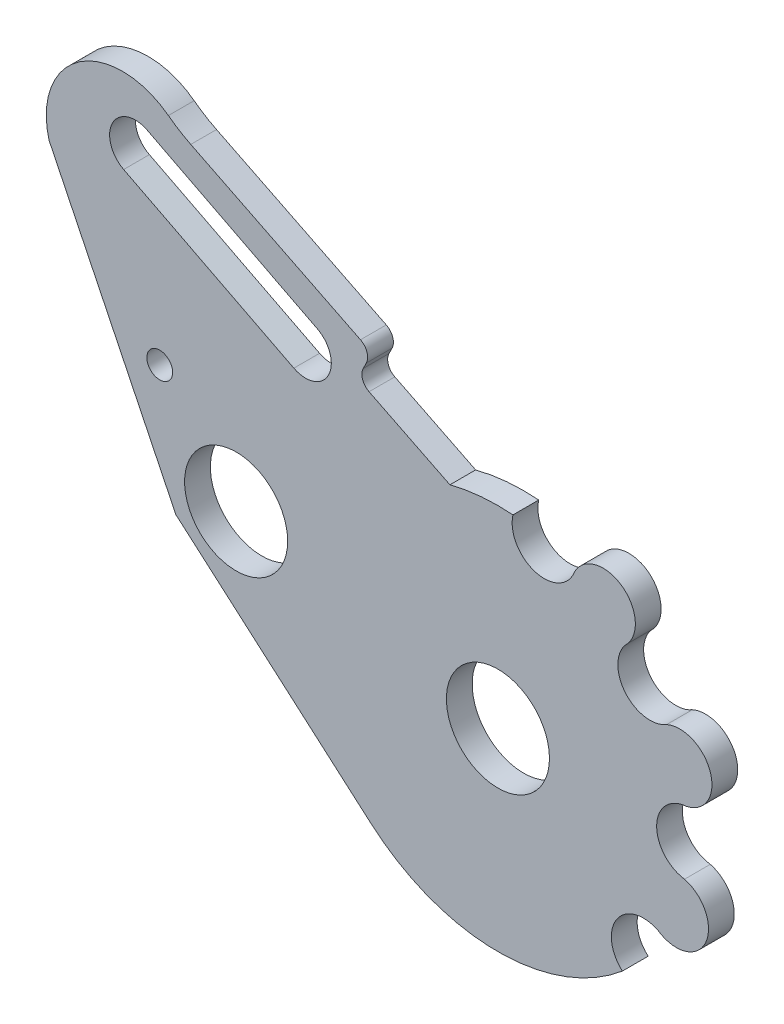
ISO-10303-21;
HEADER;
FILE_DESCRIPTION(('STEP AP214'),'2;1');
FILE_NAME('part.step','',(''),(''),'','','');
FILE_SCHEMA(('AUTOMOTIVE_DESIGN { 1 0 10303 214 1 1 1 1 }'));
ENDSEC;
DATA;
#1=APPLICATION_CONTEXT('core data for automotive mechanical design processes');
#2=APPLICATION_PROTOCOL_DEFINITION('international standard','automotive_design',2000,#1);
#3=PRODUCT_CONTEXT('',#1,'mechanical');
#4=PRODUCT('Part','Part','',(#3));
#5=PRODUCT_RELATED_PRODUCT_CATEGORY('part','',(#4));
#6=PRODUCT_DEFINITION_FORMATION('','',#4);
#7=PRODUCT_DEFINITION_CONTEXT('part definition',#1,'design');
#8=PRODUCT_DEFINITION('design','',#6,#7);
#9=PRODUCT_DEFINITION_SHAPE('','',#8);
#10=(LENGTH_UNIT() NAMED_UNIT(*) SI_UNIT(.MILLI.,.METRE.));
#11=(NAMED_UNIT(*) PLANE_ANGLE_UNIT() SI_UNIT($,.RADIAN.));
#12=(NAMED_UNIT(*) SI_UNIT($,.STERADIAN.) SOLID_ANGLE_UNIT());
#13=UNCERTAINTY_MEASURE_WITH_UNIT(LENGTH_MEASURE(1.E-05),#10,'distance_accuracy_value','');
#14=(GEOMETRIC_REPRESENTATION_CONTEXT(3) GLOBAL_UNCERTAINTY_ASSIGNED_CONTEXT((#13)) GLOBAL_UNIT_ASSIGNED_CONTEXT((#10,
#11,#12)) REPRESENTATION_CONTEXT('',''));
#15=CARTESIAN_POINT('',(0.,0.,0.));
#16=DIRECTION('',(0.,0.,1.));
#17=DIRECTION('',(1.,0.,0.));
#18=AXIS2_PLACEMENT_3D('',#15,#16,#17);
#19=CARTESIAN_POINT('',(-14.9359678839183,18.0926132591885,2.));
#20=DIRECTION('',(0.,0.,-1.));
#21=DIRECTION('',(-1.,0.,0.));
#22=AXIS2_PLACEMENT_3D('',#19,#20,#21);
#23=CYLINDRICAL_SURFACE('',#22,2.);
#24=CARTESIAN_POINT('',(-14.9359678839183,18.0926132591885,0.));
#25=DIRECTION('',(0.,0.,1.));
#26=DIRECTION('',(1.,0.,0.));
#27=AXIS2_PLACEMENT_3D('',#24,#25,#26);
#28=CIRCLE('',#27,2.);
#29=CARTESIAN_POINT('',(-15.846044198805,16.3116693799261,0.));
#30=VERTEX_POINT('',#29);
#31=CARTESIAN_POINT('',(-14.0258915690315,19.8735571384509,0.));
#32=VERTEX_POINT('',#31);
#33=EDGE_CURVE('E308',#30,#32,#28,.T.);
#34=ORIENTED_EDGE('',*,*,#33,.F.);
#35=DIRECTION('',(0.,0.,-1.));
#36=VECTOR('',#35,1.);
#37=CARTESIAN_POINT('',(-15.846044198805,16.3116693799261,2.));
#38=LINE('',#37,#36);
#39=CARTESIAN_POINT('',(-15.846044198805,16.3116693799261,2.));
#40=VERTEX_POINT('',#39);
#41=EDGE_CURVE('E324',#40,#30,#38,.T.);
#42=ORIENTED_EDGE('',*,*,#41,.F.);
#43=CARTESIAN_POINT('',(-14.9359678839183,18.0926132591885,2.));
#44=DIRECTION('',(0.,0.,1.));
#45=DIRECTION('',(1.,0.,0.));
#46=AXIS2_PLACEMENT_3D('',#43,#44,#45);
#47=CIRCLE('',#46,2.);
#48=CARTESIAN_POINT('',(-14.0258915690315,19.8735571384509,2.));
#49=VERTEX_POINT('',#48);
#50=EDGE_CURVE('E250',#40,#49,#47,.T.);
#51=ORIENTED_EDGE('',*,*,#50,.T.);
#52=DIRECTION('',(0.,0.,-1.));
#53=VECTOR('',#52,1.);
#54=CARTESIAN_POINT('',(-14.0258915690315,19.8735571384509,2.));
#55=LINE('',#54,#53);
#56=EDGE_CURVE('E194',#49,#32,#55,.T.);
#57=ORIENTED_EDGE('',*,*,#56,.T.);
#58=EDGE_LOOP('',(#34,#42,#51,#57));
#59=FACE_BOUND('',#58,.T.);
#60=ADVANCED_FACE('F35',(#59),#23,.F.);
#61=CARTESIAN_POINT('',(3.32838985168127,6.51338292974766,2.));
#62=DIRECTION('',(0.455038157443362,0.890471939631199,0.));
#63=DIRECTION('',(-0.890471939631199,0.455038157443362,0.));
#64=AXIS2_PLACEMENT_3D('',#61,#62,#63);
#65=PLANE('',#64);
#66=DIRECTION('',(0.890471939631199,-0.455038157443362,0.));
#67=VECTOR('',#66,1.);
#68=CARTESIAN_POINT('',(3.32838985168127,6.51338292974766,0.));
#69=LINE('',#68,#67);
#70=CARTESIAN_POINT('',(-29.0580755639299,23.0631212122661,0.));
#71=VERTEX_POINT('',#70);
#72=EDGE_CURVE('E311',#71,#30,#69,.T.);
#73=ORIENTED_EDGE('',*,*,#72,.F.);
#74=DIRECTION('',(0.,0.,-1.));
#75=VECTOR('',#74,1.);
#76=CARTESIAN_POINT('',(-29.0580755639299,23.0631212122661,2.));
#77=LINE('',#76,#75);
#78=CARTESIAN_POINT('',(-29.0580755639299,23.0631212122661,2.));
#79=VERTEX_POINT('',#78);
#80=EDGE_CURVE('E322',#79,#71,#77,.T.);
#81=ORIENTED_EDGE('',*,*,#80,.F.);
#82=DIRECTION('',(0.890471939631199,-0.455038157443362,0.));
#83=VECTOR('',#82,1.);
#84=CARTESIAN_POINT('',(3.32838985168127,6.51338292974766,2.));
#85=LINE('',#84,#83);
#86=EDGE_CURVE('E253',#79,#40,#85,.T.);
#87=ORIENTED_EDGE('',*,*,#86,.T.);
#88=ORIENTED_EDGE('',*,*,#41,.T.);
#89=EDGE_LOOP('',(#73,#81,#87,#88));
#90=FACE_BOUND('',#89,.T.);
#91=ADVANCED_FACE('F394',(#90),#65,.T.);
#92=CARTESIAN_POINT('',(-28.1479992490432,24.8440650915285,2.));
#93=DIRECTION('',(0.,0.,-1.));
#94=DIRECTION('',(-1.,0.,0.));
#95=AXIS2_PLACEMENT_3D('',#92,#93,#94);
#96=CYLINDRICAL_SURFACE('',#95,2.);
#97=CARTESIAN_POINT('',(-28.1479992490432,24.8440650915285,0.));
#98=DIRECTION('',(0.,0.,1.));
#99=DIRECTION('',(1.,0.,0.));
#100=AXIS2_PLACEMENT_3D('',#97,#98,#99);
#101=CIRCLE('',#100,2.);
#102=CARTESIAN_POINT('',(-27.2379229341565,26.6250089707909,0.));
#103=VERTEX_POINT('',#102);
#104=EDGE_CURVE('E314',#103,#71,#101,.T.);
#105=ORIENTED_EDGE('',*,*,#104,.F.);
#106=DIRECTION('',(0.,0.,-1.));
#107=VECTOR('',#106,1.);
#108=CARTESIAN_POINT('',(-27.2379229341565,26.6250089707909,2.));
#109=LINE('',#108,#107);
#110=CARTESIAN_POINT('',(-27.2379229341565,26.6250089707909,2.));
#111=VERTEX_POINT('',#110);
#112=EDGE_CURVE('E320',#111,#103,#109,.T.);
#113=ORIENTED_EDGE('',*,*,#112,.F.);
#114=CARTESIAN_POINT('',(-28.1479992490432,24.8440650915285,2.));
#115=DIRECTION('',(0.,0.,1.));
#116=DIRECTION('',(1.,0.,0.));
#117=AXIS2_PLACEMENT_3D('',#114,#115,#116);
#118=CIRCLE('',#117,2.);
#119=EDGE_CURVE('E256',#111,#79,#118,.T.);
#120=ORIENTED_EDGE('',*,*,#119,.T.);
#121=ORIENTED_EDGE('',*,*,#80,.T.);
#122=EDGE_LOOP('',(#105,#113,#120,#121));
#123=FACE_BOUND('',#122,.T.);
#124=ADVANCED_FACE('F400',(#123),#96,.F.);
#125=CARTESIAN_POINT('',(11.3067980667604,-9.59252122782368,2.));
#126=DIRECTION('',(0.,0.,-1.));
#127=DIRECTION('',(-1.,0.,0.));
#128=AXIS2_PLACEMENT_3D('',#125,#126,#127);
#129=CYLINDRICAL_SURFACE('',#128,2.5);
#130=CARTESIAN_POINT('',(11.3067980667604,-9.59252122782368,0.));
#131=DIRECTION('',(0.,0.,1.));
#132=DIRECTION('',(1.,0.,0.));
#133=AXIS2_PLACEMENT_3D('',#130,#131,#132);
#134=CIRCLE('',#133,2.5);
#135=CARTESIAN_POINT('',(12.711512496022,-7.52448414589692,0.));
#136=VERTEX_POINT('',#135);
#137=CARTESIAN_POINT('',(9.66110025477495,-11.4744560597524,0.));
#138=VERTEX_POINT('',#137);
#139=EDGE_CURVE('E190',#136,#138,#134,.T.);
#140=ORIENTED_EDGE('',*,*,#139,.F.);
#141=DIRECTION('',(0.,0.,-1.));
#142=VECTOR('',#141,1.);
#143=CARTESIAN_POINT('',(12.711512496022,-7.52448414589692,2.));
#144=LINE('',#143,#142);
#145=CARTESIAN_POINT('',(12.711512496022,-7.52448414589692,2.));
#146=VERTEX_POINT('',#145);
#147=EDGE_CURVE('E184',#146,#136,#144,.T.);
#148=ORIENTED_EDGE('',*,*,#147,.F.);
#149=CARTESIAN_POINT('',(11.3067980667604,-9.59252122782368,2.));
#150=DIRECTION('',(0.,0.,1.));
#151=DIRECTION('',(1.,0.,0.));
#152=AXIS2_PLACEMENT_3D('',#149,#150,#151);
#153=CIRCLE('',#152,2.5);
#154=CARTESIAN_POINT('',(9.66110025477495,-11.4744560597524,2.));
#155=VERTEX_POINT('',#154);
#156=EDGE_CURVE('E188',#146,#155,#153,.T.);
#157=ORIENTED_EDGE('',*,*,#156,.T.);
#158=DIRECTION('',(0.,0.,-1.));
#159=VECTOR('',#158,1.);
#160=CARTESIAN_POINT('',(9.66110025477495,-11.4744560597524,2.));
#161=LINE('',#160,#159);
#162=EDGE_CURVE('E261',#155,#138,#161,.T.);
#163=ORIENTED_EDGE('',*,*,#162,.T.);
#164=EDGE_LOOP('',(#140,#148,#157,#163));
#165=FACE_BOUND('',#164,.T.);
#166=ADVANCED_FACE('F186',(#165),#129,.F.);
#167=CARTESIAN_POINT('',(13.8488157974996,-5.29815505960978,2.));
#168=DIRECTION('',(0.,0.,-1.));
#169=DIRECTION('',(-1.,0.,0.));
#170=AXIS2_PLACEMENT_3D('',#167,#168,#169);
#171=CYLINDRICAL_SURFACE('',#170,2.5);
#172=CARTESIAN_POINT('',(13.8488157974996,-5.29815505960978,0.));
#173=DIRECTION('',(0.,0.,1.));
#174=DIRECTION('',(1.,0.,0.));
#175=AXIS2_PLACEMENT_3D('',#172,#173,#174);
#176=CIRCLE('',#175,2.5);
#177=CARTESIAN_POINT('',(14.4878912158803,-2.88121844281123,0.));
#178=VERTEX_POINT('',#177);
#179=EDGE_CURVE('E266',#136,#178,#176,.T.);
#180=ORIENTED_EDGE('',*,*,#179,.T.);
#181=DIRECTION('',(0.,0.,-1.));
#182=VECTOR('',#181,1.);
#183=CARTESIAN_POINT('',(14.4878912158803,-2.88121844281123,2.));
#184=LINE('',#183,#182);
#185=CARTESIAN_POINT('',(14.4878912158803,-2.88121844281123,2.));
#186=VERTEX_POINT('',#185);
#187=EDGE_CURVE('E195',#186,#178,#184,.T.);
#188=ORIENTED_EDGE('',*,*,#187,.F.);
#189=CARTESIAN_POINT('',(13.8488157974996,-5.29815505960978,2.));
#190=DIRECTION('',(0.,0.,1.));
#191=DIRECTION('',(1.,0.,0.));
#192=AXIS2_PLACEMENT_3D('',#189,#190,#191);
#193=CIRCLE('',#192,2.5);
#194=EDGE_CURVE('E198',#146,#186,#193,.T.);
#195=ORIENTED_EDGE('',*,*,#194,.F.);
#196=ORIENTED_EDGE('',*,*,#147,.T.);
#197=EDGE_LOOP('',(#180,#188,#195,#196));
#198=FACE_BOUND('',#197,.T.);
#199=ADVANCED_FACE('F199',(#198),#171,.T.);
#200=CARTESIAN_POINT('',(14.8221859615863,-0.403669851361737,2.));
#201=DIRECTION('',(0.,0.,-1.));
#202=DIRECTION('',(-1.,0.,0.));
#203=AXIS2_PLACEMENT_3D('',#200,#201,#202);
#204=CYLINDRICAL_SURFACE('',#203,2.5);
#205=CARTESIAN_POINT('',(14.8221859615863,-0.403669851361737,0.));
#206=DIRECTION('',(0.,0.,1.));
#207=DIRECTION('',(1.,0.,0.));
#208=AXIS2_PLACEMENT_3D('',#205,#206,#207);
#209=CIRCLE('',#208,2.5);
#210=CARTESIAN_POINT('',(14.6232346563307,2.08840125078144,0.));
#211=VERTEX_POINT('',#210);
#212=EDGE_CURVE('E268',#211,#178,#209,.T.);
#213=ORIENTED_EDGE('',*,*,#212,.F.);
#214=DIRECTION('',(0.,0.,-1.));
#215=VECTOR('',#214,1.);
#216=CARTESIAN_POINT('',(14.6232346563307,2.08840125078144,2.));
#217=LINE('',#216,#215);
#218=CARTESIAN_POINT('',(14.6232346563307,2.08840125078144,2.));
#219=VERTEX_POINT('',#218);
#220=EDGE_CURVE('E348',#219,#211,#217,.T.);
#221=ORIENTED_EDGE('',*,*,#220,.F.);
#222=CARTESIAN_POINT('',(14.8221859615863,-0.403669851361737,2.));
#223=DIRECTION('',(0.,0.,1.));
#224=DIRECTION('',(1.,0.,0.));
#225=AXIS2_PLACEMENT_3D('',#222,#223,#224);
#226=CIRCLE('',#225,2.5);
#227=EDGE_CURVE('E203',#219,#186,#226,.T.);
#228=ORIENTED_EDGE('',*,*,#227,.T.);
#229=ORIENTED_EDGE('',*,*,#187,.T.);
#230=EDGE_LOOP('',(#213,#221,#228,#229));
#231=FACE_BOUND('',#230,.T.);
#232=ADVANCED_FACE('F454',(#231),#204,.F.);
#233=CARTESIAN_POINT('',(14.1166554686715,4.53653881363009,2.));
#234=DIRECTION('',(0.,0.,-1.));
#235=DIRECTION('',(-1.,0.,0.));
#236=AXIS2_PLACEMENT_3D('',#233,#234,#235);
#237=CYLINDRICAL_SURFACE('',#236,2.50000000000001);
#238=CARTESIAN_POINT('',(14.1166554686715,4.53653881363009,0.));
#239=DIRECTION('',(0.,0.,1.));
#240=DIRECTION('',(1.,0.,0.));
#241=AXIS2_PLACEMENT_3D('',#238,#239,#240);
#242=CIRCLE('',#241,2.50000000000001);
#243=CARTESIAN_POINT('',(13.1022125420899,6.82146891074653,0.));
#244=VERTEX_POINT('',#243);
#245=EDGE_CURVE('E271',#211,#244,#242,.T.);
#246=ORIENTED_EDGE('',*,*,#245,.T.);
#247=DIRECTION('',(0.,0.,-1.));
#248=VECTOR('',#247,1.);
#249=CARTESIAN_POINT('',(13.1022125420899,6.82146891074653,2.));
#250=LINE('',#249,#248);
#251=CARTESIAN_POINT('',(13.1022125420899,6.82146891074653,2.));
#252=VERTEX_POINT('',#251);
#253=EDGE_CURVE('E346',#252,#244,#250,.T.);
#254=ORIENTED_EDGE('',*,*,#253,.F.);
#255=CARTESIAN_POINT('',(14.1166554686715,4.53653881363009,2.));
#256=DIRECTION('',(0.,0.,1.));
#257=DIRECTION('',(1.,0.,0.));
#258=AXIS2_PLACEMENT_3D('',#255,#256,#257);
#259=CIRCLE('',#258,2.50000000000001);
#260=EDGE_CURVE('E218',#219,#252,#259,.T.);
#261=ORIENTED_EDGE('',*,*,#260,.F.);
#262=ORIENTED_EDGE('',*,*,#220,.T.);
#263=EDGE_LOOP('',(#246,#254,#261,#262));
#264=FACE_BOUND('',#263,.T.);
#265=ADVANCED_FACE('F450',(#264),#237,.T.);
#266=CARTESIAN_POINT('',(11.8121393603798,8.96289628187838,2.));
#267=DIRECTION('',(0.,0.,-1.));
#268=DIRECTION('',(-1.,0.,0.));
#269=AXIS2_PLACEMENT_3D('',#266,#267,#268);
#270=CYLINDRICAL_SURFACE('',#269,2.5);
#271=CARTESIAN_POINT('',(11.8121393603798,8.96289628187838,0.));
#272=DIRECTION('',(0.,0.,1.));
#273=DIRECTION('',(1.,0.,0.));
#274=AXIS2_PLACEMENT_3D('',#271,#272,#273);
#275=CIRCLE('',#274,2.5);
#276=CARTESIAN_POINT('',(10.0971101914994,10.7818726285881,0.));
#277=VERTEX_POINT('',#276);
#278=EDGE_CURVE('E274',#277,#244,#275,.T.);
#279=ORIENTED_EDGE('',*,*,#278,.F.);
#280=DIRECTION('',(0.,0.,-1.));
#281=VECTOR('',#280,1.);
#282=CARTESIAN_POINT('',(10.0971101914994,10.7818726285881,2.));
#283=LINE('',#282,#281);
#284=CARTESIAN_POINT('',(10.0971101914994,10.7818726285881,2.));
#285=VERTEX_POINT('',#284);
#286=EDGE_CURVE('E344',#285,#277,#283,.T.);
#287=ORIENTED_EDGE('',*,*,#286,.F.);
#288=CARTESIAN_POINT('',(11.8121393603798,8.96289628187838,2.));
#289=DIRECTION('',(0.,0.,1.));
#290=DIRECTION('',(1.,0.,0.));
#291=AXIS2_PLACEMENT_3D('',#288,#289,#290);
#292=CIRCLE('',#291,2.5);
#293=EDGE_CURVE('E220',#285,#252,#292,.T.);
#294=ORIENTED_EDGE('',*,*,#293,.T.);
#295=ORIENTED_EDGE('',*,*,#253,.T.);
#296=EDGE_LOOP('',(#279,#287,#294,#295));
#297=FACE_BOUND('',#296,.T.);
#298=ADVANCED_FACE('F446',(#297),#270,.F.);
#299=CARTESIAN_POINT('',(8.16966887854774,12.3740315355842,2.));
#300=DIRECTION('',(0.,0.,-1.));
#301=DIRECTION('',(-1.,0.,0.));
#302=AXIS2_PLACEMENT_3D('',#299,#300,#301);
#303=CYLINDRICAL_SURFACE('',#302,2.5);
#304=CARTESIAN_POINT('',(8.16966887854774,12.3740315355842,0.));
#305=DIRECTION('',(0.,0.,1.));
#306=DIRECTION('',(1.,0.,0.));
#307=AXIS2_PLACEMENT_3D('',#304,#305,#306);
#308=CIRCLE('',#307,2.5);
#309=CARTESIAN_POINT('',(5.94831385553742,13.5210197054215,0.));
#310=VERTEX_POINT('',#309);
#311=EDGE_CURVE('E277',#277,#310,#308,.T.);
#312=ORIENTED_EDGE('',*,*,#311,.T.);
#313=DIRECTION('',(0.,0.,-1.));
#314=VECTOR('',#313,1.);
#315=CARTESIAN_POINT('',(5.94831385553742,13.5210197054215,2.));
#316=LINE('',#315,#314);
#317=CARTESIAN_POINT('',(5.94831385553742,13.5210197054215,2.));
#318=VERTEX_POINT('',#317);
#319=EDGE_CURVE('E342',#318,#310,#316,.T.);
#320=ORIENTED_EDGE('',*,*,#319,.F.);
#321=CARTESIAN_POINT('',(8.16966887854774,12.3740315355842,2.));
#322=DIRECTION('',(0.,0.,1.));
#323=DIRECTION('',(1.,0.,0.));
#324=AXIS2_PLACEMENT_3D('',#321,#322,#323);
#325=CIRCLE('',#324,2.5);
#326=EDGE_CURVE('E223',#285,#318,#325,.T.);
#327=ORIENTED_EDGE('',*,*,#326,.F.);
#328=ORIENTED_EDGE('',*,*,#286,.T.);
#329=EDGE_LOOP('',(#312,#320,#327,#328));
#330=FACE_BOUND('',#329,.T.);
#331=ADVANCED_FACE('F442',(#330),#303,.T.);
#332=CARTESIAN_POINT('',(3.60182460345563,14.3835672054844,2.));
#333=DIRECTION('',(0.,0.,-1.));
#334=DIRECTION('',(-1.,0.,0.));
#335=AXIS2_PLACEMENT_3D('',#332,#333,#334);
#336=CYLINDRICAL_SURFACE('',#335,2.5);
#337=CARTESIAN_POINT('',(3.60182460345563,14.3835672054844,0.));
#338=DIRECTION('',(0.,0.,1.));
#339=DIRECTION('',(1.,0.,0.));
#340=AXIS2_PLACEMENT_3D('',#337,#338,#339);
#341=CIRCLE('',#340,2.5);
#342=CARTESIAN_POINT('',(1.16788239643984,14.95446591183,0.));
#343=VERTEX_POINT('',#342);
#344=EDGE_CURVE('E280',#343,#310,#341,.T.);
#345=ORIENTED_EDGE('',*,*,#344,.F.);
#346=DIRECTION('',(0.,0.,-1.));
#347=VECTOR('',#346,1.);
#348=CARTESIAN_POINT('',(1.16788239643984,14.95446591183,2.));
#349=LINE('',#348,#347);
#350=CARTESIAN_POINT('',(1.16788239643984,14.95446591183,2.));
#351=VERTEX_POINT('',#350);
#352=EDGE_CURVE('E340',#351,#343,#349,.T.);
#353=ORIENTED_EDGE('',*,*,#352,.F.);
#354=CARTESIAN_POINT('',(3.60182460345563,14.3835672054844,2.));
#355=DIRECTION('',(0.,0.,1.));
#356=DIRECTION('',(1.,0.,0.));
#357=AXIS2_PLACEMENT_3D('',#354,#355,#356);
#358=CIRCLE('',#357,2.5);
#359=EDGE_CURVE('E225',#351,#318,#358,.T.);
#360=ORIENTED_EDGE('',*,*,#359,.T.);
#361=ORIENTED_EDGE('',*,*,#319,.T.);
#362=EDGE_LOOP('',(#345,#353,#360,#361));
#363=FACE_BOUND('',#362,.T.);
#364=ADVANCED_FACE('F439',(#363),#336,.F.);
#365=CARTESIAN_POINT('',(0.,0.,2.));
#366=DIRECTION('',(0.,0.,-1.));
#367=DIRECTION('',(-1.,0.,0.));
#368=AXIS2_PLACEMENT_3D('',#365,#366,#367);
#369=CYLINDRICAL_SURFACE('',#368,15.);
#370=CARTESIAN_POINT('',(0.,0.,0.));
#371=DIRECTION('',(0.,0.,1.));
#372=DIRECTION('',(1.,0.,0.));
#373=AXIS2_PLACEMENT_3D('',#370,#371,#372);
#374=CIRCLE('',#373,15.);
#375=CARTESIAN_POINT('',(-3.72843212824844,14.529239273446,0.));
#376=VERTEX_POINT('',#375);
#377=EDGE_CURVE('E283',#343,#376,#374,.T.);
#378=ORIENTED_EDGE('',*,*,#377,.T.);
#379=DIRECTION('',(0.,0.,-1.));
#380=VECTOR('',#379,1.);
#381=CARTESIAN_POINT('',(-3.72843212824844,14.529239273446,2.));
#382=LINE('',#381,#380);
#383=CARTESIAN_POINT('',(-3.72843212824844,14.529239273446,2.));
#384=VERTEX_POINT('',#383);
#385=EDGE_CURVE('E337',#384,#376,#382,.T.);
#386=ORIENTED_EDGE('',*,*,#385,.F.);
#387=CARTESIAN_POINT('',(0.,0.,2.));
#388=DIRECTION('',(0.,0.,1.));
#389=DIRECTION('',(1.,0.,0.));
#390=AXIS2_PLACEMENT_3D('',#387,#388,#389);
#391=CIRCLE('',#390,15.);
#392=EDGE_CURVE('E228',#351,#384,#391,.T.);
#393=ORIENTED_EDGE('',*,*,#392,.F.);
#394=ORIENTED_EDGE('',*,*,#352,.T.);
#395=EDGE_LOOP('',(#378,#386,#393,#394));
#396=FACE_BOUND('',#395,.T.);
#397=ADVANCED_FACE('F420',(#396),#369,.T.);
#398=CARTESIAN_POINT('',(5.0508803223758,10.1683141739315,2.));
#399=DIRECTION('',(0.444867319818385,0.895596487128889,0.));
#400=DIRECTION('',(-0.895596487128889,0.444867319818385,0.));
#401=AXIS2_PLACEMENT_3D('',#398,#399,#400);
#402=PLANE('',#401);
#403=DIRECTION('',(0.895596487128889,-0.444867319818385,0.));
#404=VECTOR('',#403,1.);
#405=CARTESIAN_POINT('',(5.0508803223758,10.1683141739315,0.));
#406=LINE('',#405,#404);
#407=CARTESIAN_POINT('',(-10.006536836479,17.6477459393702,0.));
#408=VERTEX_POINT('',#407);
#409=EDGE_CURVE('E286',#408,#376,#406,.T.);
#410=ORIENTED_EDGE('',*,*,#409,.F.);
#411=DIRECTION('',(0.,0.,-1.));
#412=VECTOR('',#411,1.);
#413=CARTESIAN_POINT('',(-10.006536836479,17.6477459393702,2.));
#414=LINE('',#413,#412);
#415=CARTESIAN_POINT('',(-10.006536836479,17.6477459393702,2.));
#416=VERTEX_POINT('',#415);
#417=EDGE_CURVE('E355',#408,#416,#414,.F.);
#418=ORIENTED_EDGE('',*,*,#417,.T.);
#419=DIRECTION('',(0.895596487128889,-0.444867319818385,0.));
#420=VECTOR('',#419,1.);
#421=CARTESIAN_POINT('',(5.0508803223758,10.1683141739315,2.));
#422=LINE('',#421,#420);
#423=EDGE_CURVE('E231',#416,#384,#422,.T.);
#424=ORIENTED_EDGE('',*,*,#423,.T.);
#425=ORIENTED_EDGE('',*,*,#385,.T.);
#426=EDGE_LOOP('',(#410,#418,#424,#425));
#427=FACE_BOUND('',#426,.T.);
#428=ADVANCED_FACE('F434',(#427),#402,.T.);
#429=CARTESIAN_POINT('',(-15.9530136459837,7.92429908525706,2.));
#430=DIRECTION('',(-0.895596487128889,0.444867319818385,0.));
#431=DIRECTION('',(-0.444867319818385,-0.895596487128889,0.));
#432=AXIS2_PLACEMENT_3D('',#429,#430,#431);
#433=PLANE('',#432);
#434=DIRECTION('',(0.444867319818385,0.895596487128889,0.));
#435=VECTOR('',#434,1.);
#436=CARTESIAN_POINT('',(-15.9530136459837,7.92429908525706,2.));
#437=LINE('',#436,#435);
#438=CARTESIAN_POINT('',(-10.4572660037895,18.9882097463174,2.));
#439=VERTEX_POINT('',#438);
#440=CARTESIAN_POINT('',(-10.2190110297542,19.4678590895735,2.));
#441=VERTEX_POINT('',#440);
#442=EDGE_CURVE('E233',#439,#441,#437,.T.);
#443=ORIENTED_EDGE('',*,*,#442,.F.);
#444=DIRECTION('',(0.,0.,-1.));
#445=VECTOR('',#444,1.);
#446=CARTESIAN_POINT('',(-10.4572660037895,18.9882097463174,2.));
#447=LINE('',#446,#445);
#448=CARTESIAN_POINT('',(-10.4572660037895,18.9882097463174,0.));
#449=VERTEX_POINT('',#448);
#450=EDGE_CURVE('E352',#439,#449,#447,.T.);
#451=ORIENTED_EDGE('',*,*,#450,.T.);
#452=DIRECTION('',(0.444867319818385,0.895596487128889,0.));
#453=VECTOR('',#452,1.);
#454=CARTESIAN_POINT('',(-15.9530136459837,7.92429908525706,0.));
#455=LINE('',#454,#453);
#456=CARTESIAN_POINT('',(-10.2190110297542,19.4678590895735,0.));
#457=VERTEX_POINT('',#456);
#458=EDGE_CURVE('E289',#449,#457,#455,.T.);
#459=ORIENTED_EDGE('',*,*,#458,.T.);
#460=DIRECTION('',(0.,0.,-1.));
#461=VECTOR('',#460,1.);
#462=CARTESIAN_POINT('',(-10.2190110297543,19.4678590895735,2.));
#463=LINE('',#462,#461);
#464=EDGE_CURVE('E326',#457,#441,#463,.F.);
#465=ORIENTED_EDGE('',*,*,#464,.T.);
#466=EDGE_LOOP('',(#443,#451,#459,#465));
#467=FACE_BOUND('',#466,.T.);
#468=ADVANCED_FACE('F431',(#467),#433,.F.);
#469=CARTESIAN_POINT('',(6.17886993604783,12.4391564914453,2.));
#470=DIRECTION('',(-0.444867319818385,-0.895596487128889,0.));
#471=DIRECTION('',(0.895596487128889,-0.444867319818385,0.));
#472=AXIS2_PLACEMENT_3D('',#469,#470,#471);
#473=PLANE('',#472);
#474=DIRECTION('',(-0.895596487128889,0.444867319818385,0.));
#475=VECTOR('',#474,1.);
#476=CARTESIAN_POINT('',(6.17886993604783,12.4391564914453,0.));
#477=LINE('',#476,#475);
#478=CARTESIAN_POINT('',(-10.6697401970648,20.8083228965207,0.));
#479=VERTEX_POINT('',#478);
#480=CARTESIAN_POINT('',(-23.8481710126918,27.3544106498957,0.));
#481=VERTEX_POINT('',#480);
#482=EDGE_CURVE('E292',#479,#481,#477,.T.);
#483=ORIENTED_EDGE('',*,*,#482,.T.);
#484=DIRECTION('',(0.,0.,1.));
#485=VECTOR('',#484,1.);
#486=CARTESIAN_POINT('',(-23.8481710126918,27.3544106498957,2.));
#487=LINE('',#486,#485);
#488=CARTESIAN_POINT('',(-23.8481710126918,27.3544106498957,2.));
#489=VERTEX_POINT('',#488);
#490=EDGE_CURVE('E56',#481,#489,#487,.T.);
#491=ORIENTED_EDGE('',*,*,#490,.T.);
#492=DIRECTION('',(-0.895596487128889,0.444867319818385,0.));
#493=VECTOR('',#492,1.);
#494=CARTESIAN_POINT('',(6.17886993604783,12.4391564914453,2.));
#495=LINE('',#494,#493);
#496=CARTESIAN_POINT('',(-10.6697401970648,20.8083228965207,2.));
#497=VERTEX_POINT('',#496);
#498=EDGE_CURVE('E235',#497,#489,#495,.T.);
#499=ORIENTED_EDGE('',*,*,#498,.F.);
#500=DIRECTION('',(0.,0.,-1.));
#501=VECTOR('',#500,1.);
#502=CARTESIAN_POINT('',(-10.6697401970648,20.8083228965207,2.));
#503=LINE('',#502,#501);
#504=EDGE_CURVE('E357',#497,#479,#503,.T.);
#505=ORIENTED_EDGE('',*,*,#504,.T.);
#506=EDGE_LOOP('',(#483,#491,#499,#505));
#507=FACE_BOUND('',#506,.T.);
#508=ADVANCED_FACE('F428',(#507),#473,.F.);
#509=CARTESIAN_POINT('',(-29.1494212263783,23.7070956599862,2.));
#510=DIRECTION('',(0.,0.,-1.));
#511=DIRECTION('',(-1.,0.,0.));
#512=AXIS2_PLACEMENT_3D('',#509,#510,#511);
#513=CYLINDRICAL_SURFACE('',#512,5.91606989611819);
#514=CARTESIAN_POINT('',(-29.1494212263783,23.7070956599862,2.));
#515=DIRECTION('',(0.,0.,1.));
#516=DIRECTION('',(1.,0.,0.));
#517=AXIS2_PLACEMENT_3D('',#514,#515,#516);
#518=CIRCLE('',#517,5.91606989611819);
#519=CARTESIAN_POINT('',(-25.583989366889,28.4280678767117,2.));
#520=VERTEX_POINT('',#519);
#521=CARTESIAN_POINT('',(-34.8560748827532,22.1469716066049,2.));
#522=VERTEX_POINT('',#521);
#523=EDGE_CURVE('E237',#520,#522,#518,.T.);
#524=ORIENTED_EDGE('',*,*,#523,.F.);
#525=DIRECTION('',(0.,0.,-1.));
#526=VECTOR('',#525,1.);
#527=CARTESIAN_POINT('',(-25.583989366889,28.4280678767117,2.));
#528=LINE('',#527,#526);
#529=CARTESIAN_POINT('',(-25.583989366889,28.4280678767117,0.));
#530=VERTEX_POINT('',#529);
#531=EDGE_CURVE('E368',#520,#530,#528,.T.);
#532=ORIENTED_EDGE('',*,*,#531,.T.);
#533=CARTESIAN_POINT('',(-29.1494212263783,23.7070956599862,0.));
#534=DIRECTION('',(0.,0.,1.));
#535=DIRECTION('',(1.,0.,0.));
#536=AXIS2_PLACEMENT_3D('',#533,#534,#535);
#537=CIRCLE('',#536,5.91606989611819);
#538=CARTESIAN_POINT('',(-34.8560748827532,22.1469716066049,0.));
#539=VERTEX_POINT('',#538);
#540=EDGE_CURVE('E294',#530,#539,#537,.T.);
#541=ORIENTED_EDGE('',*,*,#540,.T.);
#542=DIRECTION('',(0.,0.,-1.));
#543=VECTOR('',#542,1.);
#544=CARTESIAN_POINT('',(-34.8560748827532,22.1469716066049,2.));
#545=LINE('',#544,#543);
#546=EDGE_CURVE('E334',#522,#539,#545,.T.);
#547=ORIENTED_EDGE('',*,*,#546,.F.);
#548=EDGE_LOOP('',(#524,#532,#541,#547));
#549=FACE_BOUND('',#548,.T.);
#550=ADVANCED_FACE('F374',(#549),#513,.T.);
#551=CARTESIAN_POINT('',(-19.4840843288905,-9.47234706105984,2.));
#552=DIRECTION('',(0.899351207341315,0.437226950054224,0.));
#553=DIRECTION('',(-0.437226950054224,0.899351207341315,0.));
#554=AXIS2_PLACEMENT_3D('',#551,#552,#553);
#555=PLANE('',#554);
#556=DIRECTION('',(0.437226950054225,-0.899351207341315,0.));
#557=VECTOR('',#556,1.);
#558=CARTESIAN_POINT('',(-19.4840843288905,-9.47234706105984,0.));
#559=LINE('',#558,#557);
#560=CARTESIAN_POINT('',(-25.0052814935504,1.88444449854211,0.));
#561=VERTEX_POINT('',#560);
#562=EDGE_CURVE('E296',#539,#561,#559,.T.);
#563=ORIENTED_EDGE('',*,*,#562,.T.);
#564=DIRECTION('',(0.,0.,-1.));
#565=VECTOR('',#564,1.);
#566=CARTESIAN_POINT('',(-25.0052814935504,1.88444449854211,2.));
#567=LINE('',#566,#565);
#568=CARTESIAN_POINT('',(-25.0052814935504,1.88444449854211,2.));
#569=VERTEX_POINT('',#568);
#570=EDGE_CURVE('E331',#569,#561,#567,.T.);
#571=ORIENTED_EDGE('',*,*,#570,.F.);
#572=DIRECTION('',(0.437226950054225,-0.899351207341315,0.));
#573=VECTOR('',#572,1.);
#574=CARTESIAN_POINT('',(-19.4840843288905,-9.47234706105984,2.));
#575=LINE('',#574,#573);
#576=EDGE_CURVE('E239',#522,#569,#575,.T.);
#577=ORIENTED_EDGE('',*,*,#576,.F.);
#578=ORIENTED_EDGE('',*,*,#546,.T.);
#579=EDGE_LOOP('',(#563,#571,#577,#578));
#580=FACE_BOUND('',#579,.T.);
#581=ADVANCED_FACE('F384',(#580),#555,.F.);
#582=CARTESIAN_POINT('',(-9.85060643306644,-11.3121860354588,2.));
#583=DIRECTION('',(0.656707095537763,0.754145735697256,0.));
#584=DIRECTION('',(-0.754145735697256,0.656707095537763,0.));
#585=AXIS2_PLACEMENT_3D('',#582,#583,#584);
#586=PLANE('',#585);
#587=DIRECTION('',(0.754145735697256,-0.656707095537763,0.));
#588=VECTOR('',#587,1.);
#589=CARTESIAN_POINT('',(-9.85060643306644,-11.3121860354588,0.));
#590=LINE('',#589,#588);
#591=CARTESIAN_POINT('',(-9.85060643306645,-11.3121860354588,0.));
#592=VERTEX_POINT('',#591);
#593=EDGE_CURVE('E299',#561,#592,#590,.T.);
#594=ORIENTED_EDGE('',*,*,#593,.T.);
#595=DIRECTION('',(0.,0.,-1.));
#596=VECTOR('',#595,1.);
#597=CARTESIAN_POINT('',(-9.85060643306645,-11.3121860354588,2.));
#598=LINE('',#597,#596);
#599=CARTESIAN_POINT('',(-9.85060643306645,-11.3121860354588,2.));
#600=VERTEX_POINT('',#599);
#601=EDGE_CURVE('E328',#600,#592,#598,.T.);
#602=ORIENTED_EDGE('',*,*,#601,.F.);
#603=DIRECTION('',(0.754145735697256,-0.656707095537763,0.));
#604=VECTOR('',#603,1.);
#605=CARTESIAN_POINT('',(-9.85060643306644,-11.3121860354588,2.));
#606=LINE('',#605,#604);
#607=EDGE_CURVE('E242',#569,#600,#606,.T.);
#608=ORIENTED_EDGE('',*,*,#607,.F.);
#609=ORIENTED_EDGE('',*,*,#570,.T.);
#610=EDGE_LOOP('',(#594,#602,#608,#609));
#611=FACE_BOUND('',#610,.T.);
#612=ADVANCED_FACE('F410',(#611),#586,.F.);
#613=CARTESIAN_POINT('',(-20.325227828694,4.43909071557608,2.));
#614=DIRECTION('',(0.,0.,-1.));
#615=DIRECTION('',(-1.,0.,0.));
#616=AXIS2_PLACEMENT_3D('',#613,#614,#615);
#617=CYLINDRICAL_SURFACE('',#616,4.);
#618=CARTESIAN_POINT('',(-20.325227828694,4.43909071557608,2.));
#619=DIRECTION('',(0.,0.,1.));
#620=DIRECTION('',(1.,0.,0.));
#621=AXIS2_PLACEMENT_3D('',#618,#619,#620);
#622=CIRCLE('',#621,4.);
#623=CARTESIAN_POINT('',(-16.325227828694,4.43909071557608,2.));
#624=VERTEX_POINT('',#623);
#625=EDGE_CURVE('E247',#624,#624,#622,.T.);
#626=ORIENTED_EDGE('',*,*,#625,.T.);
#627=EDGE_LOOP('',(#626));
#628=FACE_BOUND('',#627,.T.);
#629=CARTESIAN_POINT('',(-20.325227828694,4.43909071557608,0.));
#630=DIRECTION('',(0.,0.,1.));
#631=DIRECTION('',(1.,0.,0.));
#632=AXIS2_PLACEMENT_3D('',#629,#630,#631);
#633=CIRCLE('',#632,4.);
#634=CARTESIAN_POINT('',(-16.325227828694,4.43909071557608,0.));
#635=VERTEX_POINT('',#634);
#636=EDGE_CURVE('E305',#635,#635,#633,.T.);
#637=ORIENTED_EDGE('',*,*,#636,.F.);
#638=EDGE_LOOP('',(#637));
#639=FACE_BOUND('',#638,.T.);
#640=ADVANCED_FACE('F406',(#628,#639),#617,.F.);
#641=CARTESIAN_POINT('',(-26.2563871432768,11.3193235152207,2.));
#642=DIRECTION('',(0.,0.,-1.));
#643=DIRECTION('',(-1.,0.,0.));
#644=AXIS2_PLACEMENT_3D('',#641,#642,#643);
#645=CYLINDRICAL_SURFACE('',#644,1.);
#646=CARTESIAN_POINT('',(-26.2563871432768,11.3193235152207,2.));
#647=DIRECTION('',(0.,0.,1.));
#648=DIRECTION('',(1.,0.,0.));
#649=AXIS2_PLACEMENT_3D('',#646,#647,#648);
#650=CIRCLE('',#649,1.);
#651=CARTESIAN_POINT('',(-25.2563871432768,11.3193235152207,2.));
#652=VERTEX_POINT('',#651);
#653=EDGE_CURVE('E244',#652,#652,#650,.T.);
#654=ORIENTED_EDGE('',*,*,#653,.T.);
#655=EDGE_LOOP('',(#654));
#656=FACE_BOUND('',#655,.T.);
#657=CARTESIAN_POINT('',(-26.2563871432768,11.3193235152207,0.));
#658=DIRECTION('',(0.,0.,1.));
#659=DIRECTION('',(1.,0.,0.));
#660=AXIS2_PLACEMENT_3D('',#657,#658,#659);
#661=CIRCLE('',#660,1.);
#662=CARTESIAN_POINT('',(-25.2563871432768,11.3193235152207,0.));
#663=VERTEX_POINT('',#662);
#664=EDGE_CURVE('E302',#663,#663,#661,.T.);
#665=ORIENTED_EDGE('',*,*,#664,.F.);
#666=EDGE_LOOP('',(#665));
#667=FACE_BOUND('',#666,.T.);
#668=ADVANCED_FACE('F409',(#656,#667),#645,.F.);
#669=EDGE_CURVE('E287',#592,#138,#374,.T.);
#670=ORIENTED_EDGE('',*,*,#669,.T.);
#671=ORIENTED_EDGE('',*,*,#162,.F.);
#672=EDGE_CURVE('E209',#600,#155,#391,.T.);
#673=ORIENTED_EDGE('',*,*,#672,.F.);
#674=ORIENTED_EDGE('',*,*,#601,.T.);
#675=EDGE_LOOP('',(#670,#671,#673,#674));
#676=FACE_BOUND('',#675,.T.);
#677=ADVANCED_FACE('F414',(#676),#369,.T.);
#678=CARTESIAN_POINT('',(0.,0.,2.));
#679=DIRECTION('',(0.,0.,-1.));
#680=DIRECTION('',(-1.,0.,0.));
#681=AXIS2_PLACEMENT_3D('',#678,#679,#680);
#682=CYLINDRICAL_SURFACE('',#681,4.);
#683=CARTESIAN_POINT('',(0.,0.,2.));
#684=DIRECTION('',(0.,0.,1.));
#685=DIRECTION('',(1.,0.,0.));
#686=AXIS2_PLACEMENT_3D('',#683,#684,#685);
#687=CIRCLE('',#686,4.);
#688=CARTESIAN_POINT('',(4.,0.,2.));
#689=VERTEX_POINT('',#688);
#690=EDGE_CURVE('E211',#689,#689,#687,.T.);
#691=ORIENTED_EDGE('',*,*,#690,.T.);
#692=EDGE_LOOP('',(#691));
#693=FACE_BOUND('',#692,.T.);
#694=CARTESIAN_POINT('',(0.,0.,0.));
#695=DIRECTION('',(0.,0.,1.));
#696=DIRECTION('',(1.,0.,0.));
#697=AXIS2_PLACEMENT_3D('',#694,#695,#696);
#698=CIRCLE('',#697,4.);
#699=CARTESIAN_POINT('',(4.,0.,0.));
#700=VERTEX_POINT('',#699);
#701=EDGE_CURVE('E262',#700,#700,#698,.T.);
#702=ORIENTED_EDGE('',*,*,#701,.F.);
#703=EDGE_LOOP('',(#702));
#704=FACE_BOUND('',#703,.T.);
#705=ADVANCED_FACE('F418',(#693,#704),#682,.F.);
#706=CARTESIAN_POINT('',(5.14854248145472,10.0752706882725,2.));
#707=DIRECTION('',(0.455038157443362,0.890471939631199,0.));
#708=DIRECTION('',(-0.890471939631199,0.455038157443362,0.));
#709=AXIS2_PLACEMENT_3D('',#706,#707,#708);
#710=PLANE('',#709);
#711=DIRECTION('',(0.890471939631199,-0.455038157443362,0.));
#712=VECTOR('',#711,1.);
#713=CARTESIAN_POINT('',(5.14854248145472,10.0752706882725,0.));
#714=LINE('',#713,#712);
#715=EDGE_CURVE('E214',#103,#32,#714,.T.);
#716=ORIENTED_EDGE('',*,*,#715,.T.);
#717=ORIENTED_EDGE('',*,*,#56,.F.);
#718=DIRECTION('',(0.890471939631199,-0.455038157443362,0.));
#719=VECTOR('',#718,1.);
#720=CARTESIAN_POINT('',(5.14854248145472,10.0752706882725,2.));
#721=LINE('',#720,#719);
#722=EDGE_CURVE('E259',#111,#49,#721,.T.);
#723=ORIENTED_EDGE('',*,*,#722,.F.);
#724=ORIENTED_EDGE('',*,*,#112,.T.);
#725=EDGE_LOOP('',(#716,#717,#723,#724));
#726=FACE_BOUND('',#725,.T.);
#727=ADVANCED_FACE('F465',(#726),#710,.F.);
#728=CARTESIAN_POINT('',(0.,0.,2.));
#729=DIRECTION('',(0.,0.,1.));
#730=DIRECTION('',(1.,0.,0.));
#731=AXIS2_PLACEMENT_3D('',#728,#729,#730);
#732=PLANE('',#731);
#733=ORIENTED_EDGE('',*,*,#690,.F.);
#734=EDGE_LOOP('',(#733));
#735=FACE_BOUND('',#734,.T.);
#736=ORIENTED_EDGE('',*,*,#442,.T.);
#737=CARTESIAN_POINT('',(-11.1146075168831,19.9127264093919,2.));
#738=DIRECTION('',(0.,0.,1.));
#739=DIRECTION('',(1.,0.,0.));
#740=AXIS2_PLACEMENT_3D('',#737,#738,#739);
#741=CIRCLE('',#740,1.);
#742=EDGE_CURVE('E362',#441,#497,#741,.T.);
#743=ORIENTED_EDGE('',*,*,#742,.T.);
#744=ORIENTED_EDGE('',*,*,#498,.T.);
#745=CARTESIAN_POINT('',(-18.9546304946896,37.2059720083135,2.));
#746=DIRECTION('',(0.,0.,1.));
#747=DIRECTION('',(1.,0.,0.));
#748=AXIS2_PLACEMENT_3D('',#745,#746,#747);
#749=CIRCLE('',#748,11.);
#750=EDGE_CURVE('E11',#489,#520,#749,.F.);
#751=ORIENTED_EDGE('',*,*,#750,.T.);
#752=ORIENTED_EDGE('',*,*,#523,.T.);
#753=ORIENTED_EDGE('',*,*,#576,.T.);
#754=ORIENTED_EDGE('',*,*,#607,.T.);
#755=ORIENTED_EDGE('',*,*,#672,.T.);
#756=ORIENTED_EDGE('',*,*,#156,.F.);
#757=ORIENTED_EDGE('',*,*,#194,.T.);
#758=ORIENTED_EDGE('',*,*,#227,.F.);
#759=ORIENTED_EDGE('',*,*,#260,.T.);
#760=ORIENTED_EDGE('',*,*,#293,.F.);
#761=ORIENTED_EDGE('',*,*,#326,.T.);
#762=ORIENTED_EDGE('',*,*,#359,.F.);
#763=ORIENTED_EDGE('',*,*,#392,.T.);
#764=ORIENTED_EDGE('',*,*,#423,.F.);
#765=CARTESIAN_POINT('',(-9.56166951666062,18.543342426499,2.));
#766=DIRECTION('',(0.,0.,1.));
#767=DIRECTION('',(1.,0.,0.));
#768=AXIS2_PLACEMENT_3D('',#765,#766,#767);
#769=CIRCLE('',#768,1.);
#770=EDGE_CURVE('E366',#416,#439,#769,.F.);
#771=ORIENTED_EDGE('',*,*,#770,.T.);
#772=EDGE_LOOP('',(#736,#743,#744,#751,#752,#753,#754,#755,#756,#757,#758,#759,#760,#761,#762,
#763,#764,#771));
#773=FACE_BOUND('',#772,.T.);
#774=ORIENTED_EDGE('',*,*,#653,.F.);
#775=EDGE_LOOP('',(#774));
#776=FACE_BOUND('',#775,.T.);
#777=ORIENTED_EDGE('',*,*,#625,.F.);
#778=EDGE_LOOP('',(#777));
#779=FACE_BOUND('',#778,.T.);
#780=ORIENTED_EDGE('',*,*,#50,.F.);
#781=ORIENTED_EDGE('',*,*,#86,.F.);
#782=ORIENTED_EDGE('',*,*,#119,.F.);
#783=ORIENTED_EDGE('',*,*,#722,.T.);
#784=EDGE_LOOP('',(#780,#781,#782,#783));
#785=FACE_BOUND('',#784,.T.);
#786=ADVANCED_FACE('F206',(#735,#773,#776,#779,#785),#732,.T.);
#787=CARTESIAN_POINT('',(0.,0.,0.));
#788=DIRECTION('',(0.,0.,1.));
#789=DIRECTION('',(1.,0.,0.));
#790=AXIS2_PLACEMENT_3D('',#787,#788,#789);
#791=PLANE('',#790);
#792=ORIENTED_EDGE('',*,*,#701,.T.);
#793=EDGE_LOOP('',(#792));
#794=FACE_BOUND('',#793,.T.);
#795=ORIENTED_EDGE('',*,*,#482,.F.);
#796=CARTESIAN_POINT('',(-11.1146075168831,19.9127264093919,0.));
#797=DIRECTION('',(0.,0.,1.));
#798=DIRECTION('',(1.,0.,0.));
#799=AXIS2_PLACEMENT_3D('',#796,#797,#798);
#800=CIRCLE('',#799,1.);
#801=EDGE_CURVE('E360',#479,#457,#800,.F.);
#802=ORIENTED_EDGE('',*,*,#801,.T.);
#803=ORIENTED_EDGE('',*,*,#458,.F.);
#804=CARTESIAN_POINT('',(-9.56166951666062,18.543342426499,0.));
#805=DIRECTION('',(0.,0.,1.));
#806=DIRECTION('',(1.,0.,0.));
#807=AXIS2_PLACEMENT_3D('',#804,#805,#806);
#808=CIRCLE('',#807,1.);
#809=EDGE_CURVE('E364',#449,#408,#808,.T.);
#810=ORIENTED_EDGE('',*,*,#809,.T.);
#811=ORIENTED_EDGE('',*,*,#409,.T.);
#812=ORIENTED_EDGE('',*,*,#377,.F.);
#813=ORIENTED_EDGE('',*,*,#344,.T.);
#814=ORIENTED_EDGE('',*,*,#311,.F.);
#815=ORIENTED_EDGE('',*,*,#278,.T.);
#816=ORIENTED_EDGE('',*,*,#245,.F.);
#817=ORIENTED_EDGE('',*,*,#212,.T.);
#818=ORIENTED_EDGE('',*,*,#179,.F.);
#819=ORIENTED_EDGE('',*,*,#139,.T.);
#820=ORIENTED_EDGE('',*,*,#669,.F.);
#821=ORIENTED_EDGE('',*,*,#593,.F.);
#822=ORIENTED_EDGE('',*,*,#562,.F.);
#823=ORIENTED_EDGE('',*,*,#540,.F.);
#824=CARTESIAN_POINT('',(-18.9546304946896,37.2059720083135,0.));
#825=DIRECTION('',(0.,0.,1.));
#826=DIRECTION('',(1.,0.,0.));
#827=AXIS2_PLACEMENT_3D('',#824,#825,#826);
#828=CIRCLE('',#827,11.);
#829=EDGE_CURVE('E43',#530,#481,#828,.T.);
#830=ORIENTED_EDGE('',*,*,#829,.T.);
#831=EDGE_LOOP('',(#795,#802,#803,#810,#811,#812,#813,#814,#815,#816,#817,#818,#819,#820,#821,
#822,#823,#830));
#832=FACE_BOUND('',#831,.T.);
#833=ORIENTED_EDGE('',*,*,#664,.T.);
#834=EDGE_LOOP('',(#833));
#835=FACE_BOUND('',#834,.T.);
#836=ORIENTED_EDGE('',*,*,#636,.T.);
#837=EDGE_LOOP('',(#836));
#838=FACE_BOUND('',#837,.T.);
#839=ORIENTED_EDGE('',*,*,#33,.T.);
#840=ORIENTED_EDGE('',*,*,#715,.F.);
#841=ORIENTED_EDGE('',*,*,#104,.T.);
#842=ORIENTED_EDGE('',*,*,#72,.T.);
#843=EDGE_LOOP('',(#839,#840,#841,#842));
#844=FACE_BOUND('',#843,.T.);
#845=ADVANCED_FACE('F379',(#794,#832,#835,#838,#844),#791,.F.);
#846=CARTESIAN_POINT('',(-9.56166951666062,18.543342426499,2.));
#847=DIRECTION('',(0.,0.,-1.));
#848=DIRECTION('',(-1.,0.,0.));
#849=AXIS2_PLACEMENT_3D('',#846,#847,#848);
#850=CYLINDRICAL_SURFACE('',#849,1.);
#851=ORIENTED_EDGE('',*,*,#770,.F.);
#852=ORIENTED_EDGE('',*,*,#417,.F.);
#853=ORIENTED_EDGE('',*,*,#809,.F.);
#854=ORIENTED_EDGE('',*,*,#450,.F.);
#855=EDGE_LOOP('',(#851,#852,#853,#854));
#856=FACE_BOUND('',#855,.T.);
#857=ADVANCED_FACE('F391',(#856),#850,.F.);
#858=CARTESIAN_POINT('',(-11.1146075168831,19.9127264093919,2.));
#859=DIRECTION('',(0.,0.,-1.));
#860=DIRECTION('',(-1.,0.,0.));
#861=AXIS2_PLACEMENT_3D('',#858,#859,#860);
#862=CYLINDRICAL_SURFACE('',#861,1.);
#863=ORIENTED_EDGE('',*,*,#742,.F.);
#864=ORIENTED_EDGE('',*,*,#464,.F.);
#865=ORIENTED_EDGE('',*,*,#801,.F.);
#866=ORIENTED_EDGE('',*,*,#504,.F.);
#867=EDGE_LOOP('',(#863,#864,#865,#866));
#868=FACE_BOUND('',#867,.T.);
#869=ADVANCED_FACE('F387',(#868),#862,.T.);
#870=CARTESIAN_POINT('',(-18.9546304946896,37.2059720083135,2.));
#871=DIRECTION('',(0.,0.,-1.));
#872=DIRECTION('',(-1.,0.,0.));
#873=AXIS2_PLACEMENT_3D('',#870,#871,#872);
#874=CYLINDRICAL_SURFACE('',#873,11.);
#875=ORIENTED_EDGE('',*,*,#750,.F.);
#876=ORIENTED_EDGE('',*,*,#490,.F.);
#877=ORIENTED_EDGE('',*,*,#829,.F.);
#878=ORIENTED_EDGE('',*,*,#531,.F.);
#879=EDGE_LOOP('',(#875,#876,#877,#878));
#880=FACE_BOUND('',#879,.T.);
#881=ADVANCED_FACE('F37',(#880),#874,.F.);
#882=CLOSED_SHELL('',(#60,#91,#124,#166,#199,#232,#265,#298,#331,#364,#397,#428,#468,#508,#550,
#581,#612,#640,#668,#677,#705,#727,#786,#845,#857,#869,#881));
#883=MANIFOLD_SOLID_BREP('B2',#882);
#884=ADVANCED_BREP_SHAPE_REPRESENTATION('',(#18,#883),#14);
#885=SHAPE_DEFINITION_REPRESENTATION(#9,#884);
ENDSEC;
END-ISO-10303-21;
